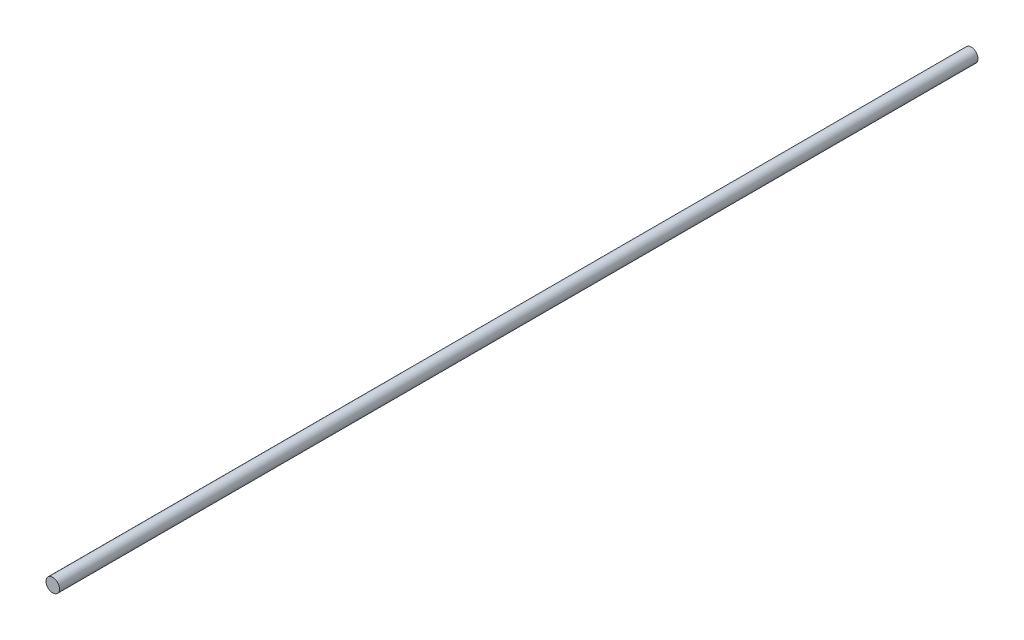
ISO-10303-21;
HEADER;
FILE_DESCRIPTION(('STEP AP214'),'2;1');
FILE_NAME('part.step','',(''),(''),'','','');
FILE_SCHEMA(('AUTOMOTIVE_DESIGN { 1 0 10303 214 1 1 1 1 }'));
ENDSEC;
DATA;
#1=APPLICATION_CONTEXT('core data for automotive mechanical design processes');
#2=APPLICATION_PROTOCOL_DEFINITION('international standard','automotive_design',2000,#1);
#3=PRODUCT_CONTEXT('',#1,'mechanical');
#4=PRODUCT('Part','Part','',(#3));
#5=PRODUCT_RELATED_PRODUCT_CATEGORY('part','',(#4));
#6=PRODUCT_DEFINITION_FORMATION('','',#4);
#7=PRODUCT_DEFINITION_CONTEXT('part definition',#1,'design');
#8=PRODUCT_DEFINITION('design','',#6,#7);
#9=PRODUCT_DEFINITION_SHAPE('','',#8);
#10=(LENGTH_UNIT() NAMED_UNIT(*) SI_UNIT(.MILLI.,.METRE.));
#11=(NAMED_UNIT(*) PLANE_ANGLE_UNIT() SI_UNIT($,.RADIAN.));
#12=(NAMED_UNIT(*) SI_UNIT($,.STERADIAN.) SOLID_ANGLE_UNIT());
#13=UNCERTAINTY_MEASURE_WITH_UNIT(LENGTH_MEASURE(1.E-05),#10,'distance_accuracy_value','');
#14=(GEOMETRIC_REPRESENTATION_CONTEXT(3) GLOBAL_UNCERTAINTY_ASSIGNED_CONTEXT((#13)) GLOBAL_UNIT_ASSIGNED_CONTEXT((#10,
#11,#12)) REPRESENTATION_CONTEXT('',''));
#15=CARTESIAN_POINT('',(0.,0.,0.));
#16=DIRECTION('',(0.,0.,1.));
#17=DIRECTION('',(1.,0.,0.));
#18=AXIS2_PLACEMENT_3D('',#15,#16,#17);
#19=CARTESIAN_POINT('',(0.,0.,340.));
#20=DIRECTION('',(0.,0.,-1.));
#21=DIRECTION('',(-1.,0.,0.));
#22=AXIS2_PLACEMENT_3D('',#19,#20,#21);
#23=CYLINDRICAL_SURFACE('',#22,2.5);
#24=CARTESIAN_POINT('',(0.,0.,340.));
#25=DIRECTION('',(0.,0.,1.));
#26=DIRECTION('',(1.,0.,0.));
#27=AXIS2_PLACEMENT_3D('',#24,#25,#26);
#28=CIRCLE('',#27,2.5);
#29=CARTESIAN_POINT('',(2.5,0.,340.));
#30=VERTEX_POINT('',#29);
#31=EDGE_CURVE('E10',#30,#30,#28,.T.);
#32=ORIENTED_EDGE('',*,*,#31,.F.);
#33=EDGE_LOOP('',(#32));
#34=FACE_BOUND('',#33,.T.);
#35=CARTESIAN_POINT('',(0.,0.,0.));
#36=DIRECTION('',(0.,0.,1.));
#37=DIRECTION('',(1.,0.,0.));
#38=AXIS2_PLACEMENT_3D('',#35,#36,#37);
#39=CIRCLE('',#38,2.5);
#40=CARTESIAN_POINT('',(2.5,0.,0.));
#41=VERTEX_POINT('',#40);
#42=EDGE_CURVE('E46',#41,#41,#39,.T.);
#43=ORIENTED_EDGE('',*,*,#42,.T.);
#44=EDGE_LOOP('',(#43));
#45=FACE_BOUND('',#44,.T.);
#46=ADVANCED_FACE('F43',(#34,#45),#23,.T.);
#47=CARTESIAN_POINT('',(0.,0.,340.));
#48=DIRECTION('',(0.,0.,1.));
#49=DIRECTION('',(1.,0.,0.));
#50=AXIS2_PLACEMENT_3D('',#47,#48,#49);
#51=PLANE('',#50);
#52=ORIENTED_EDGE('',*,*,#31,.T.);
#53=EDGE_LOOP('',(#52));
#54=FACE_BOUND('',#53,.T.);
#55=ADVANCED_FACE('F60',(#54),#51,.T.);
#56=CARTESIAN_POINT('',(0.,0.,0.));
#57=DIRECTION('',(0.,0.,1.));
#58=DIRECTION('',(1.,0.,0.));
#59=AXIS2_PLACEMENT_3D('',#56,#57,#58);
#60=PLANE('',#59);
#61=ORIENTED_EDGE('',*,*,#42,.F.);
#62=EDGE_LOOP('',(#61));
#63=FACE_BOUND('',#62,.T.);
#64=ADVANCED_FACE('F58',(#63),#60,.F.);
#65=CLOSED_SHELL('',(#46,#55,#64));
#66=MANIFOLD_SOLID_BREP('B2',#65);
#67=ADVANCED_BREP_SHAPE_REPRESENTATION('',(#18,#66),#14);
#68=SHAPE_DEFINITION_REPRESENTATION(#9,#67);
ENDSEC;
END-ISO-10303-21;
